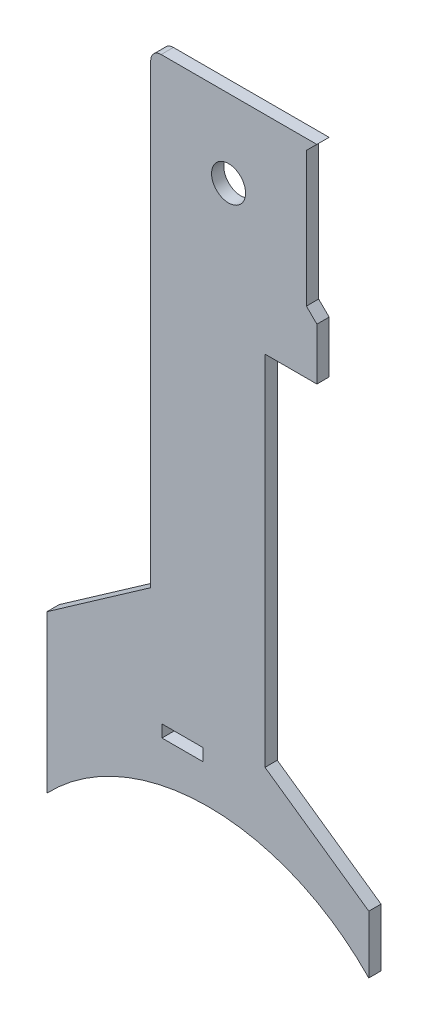
ISO-10303-21;
HEADER;
FILE_DESCRIPTION(('STEP AP214'),'2;1');
FILE_NAME('part.step','',(''),(''),'','','');
FILE_SCHEMA(('AUTOMOTIVE_DESIGN { 1 0 10303 214 1 1 1 1 }'));
ENDSEC;
DATA;
#1=APPLICATION_CONTEXT('core data for automotive mechanical design processes');
#2=APPLICATION_PROTOCOL_DEFINITION('international standard','automotive_design',2000,#1);
#3=PRODUCT_CONTEXT('',#1,'mechanical');
#4=PRODUCT('Part','Part','',(#3));
#5=PRODUCT_RELATED_PRODUCT_CATEGORY('part','',(#4));
#6=PRODUCT_DEFINITION_FORMATION('','',#4);
#7=PRODUCT_DEFINITION_CONTEXT('part definition',#1,'design');
#8=PRODUCT_DEFINITION('design','',#6,#7);
#9=PRODUCT_DEFINITION_SHAPE('','',#8);
#10=(LENGTH_UNIT() NAMED_UNIT(*) SI_UNIT(.MILLI.,.METRE.));
#11=(NAMED_UNIT(*) PLANE_ANGLE_UNIT() SI_UNIT($,.RADIAN.));
#12=(NAMED_UNIT(*) SI_UNIT($,.STERADIAN.) SOLID_ANGLE_UNIT());
#13=UNCERTAINTY_MEASURE_WITH_UNIT(LENGTH_MEASURE(1.E-05),#10,'distance_accuracy_value','');
#14=(GEOMETRIC_REPRESENTATION_CONTEXT(3) GLOBAL_UNCERTAINTY_ASSIGNED_CONTEXT((#13)) GLOBAL_UNIT_ASSIGNED_CONTEXT((#10,
#11,#12)) REPRESENTATION_CONTEXT('',''));
#15=CARTESIAN_POINT('',(0.,0.,0.));
#16=DIRECTION('',(0.,0.,1.));
#17=DIRECTION('',(1.,0.,0.));
#18=AXIS2_PLACEMENT_3D('',#15,#16,#17);
#19=CARTESIAN_POINT('',(-19.2503342679384,34.29,3.));
#20=DIRECTION('',(1.,0.,0.));
#21=DIRECTION('',(0.,0.,-1.));
#22=AXIS2_PLACEMENT_3D('',#19,#20,#21);
#23=PLANE('',#22);
#24=DIRECTION('',(0.,-1.,0.));
#25=VECTOR('',#24,1.);
#26=CARTESIAN_POINT('',(-19.2503342679384,34.29,0.));
#27=LINE('',#26,#25);
#28=CARTESIAN_POINT('',(-19.2503342679384,34.29,0.));
#29=VERTEX_POINT('',#28);
#30=CARTESIAN_POINT('',(-19.2503342679384,1.27,0.));
#31=VERTEX_POINT('',#30);
#32=EDGE_CURVE('E199',#29,#31,#27,.T.);
#33=ORIENTED_EDGE('',*,*,#32,.F.);
#34=DIRECTION('',(0.,0.,-1.));
#35=VECTOR('',#34,1.);
#36=CARTESIAN_POINT('',(-19.2503342679384,34.29,3.));
#37=LINE('',#36,#35);
#38=CARTESIAN_POINT('',(-19.2503342679384,34.29,3.));
#39=VERTEX_POINT('',#38);
#40=EDGE_CURVE('E11',#39,#29,#37,.T.);
#41=ORIENTED_EDGE('',*,*,#40,.F.);
#42=DIRECTION('',(0.,-1.,0.));
#43=VECTOR('',#42,1.);
#44=CARTESIAN_POINT('',(-19.2503342679384,34.29,3.));
#45=LINE('',#44,#43);
#46=CARTESIAN_POINT('',(-19.2503342679384,1.27,3.));
#47=VERTEX_POINT('',#46);
#48=EDGE_CURVE('E202',#39,#47,#45,.T.);
#49=ORIENTED_EDGE('',*,*,#48,.T.);
#50=DIRECTION('',(0.,0.,-1.));
#51=VECTOR('',#50,1.);
#52=CARTESIAN_POINT('',(-19.2503342679384,1.27,3.));
#53=LINE('',#52,#51);
#54=EDGE_CURVE('E37',#47,#31,#53,.T.);
#55=ORIENTED_EDGE('',*,*,#54,.T.);
#56=EDGE_LOOP('',(#33,#41,#49,#55));
#57=FACE_BOUND('',#56,.T.);
#58=ADVANCED_FACE('F34',(#57),#23,.T.);
#59=CARTESIAN_POINT('',(-16.6878,36.83,3.));
#60=DIRECTION('',(0.703977127997857,-0.710222643440695,0.));
#61=DIRECTION('',(0.710222643440695,0.703977127997857,0.));
#62=AXIS2_PLACEMENT_3D('',#59,#60,#61);
#63=PLANE('',#62);
#64=DIRECTION('',(-0.710222643440696,-0.703977127997857,0.));
#65=VECTOR('',#64,1.);
#66=CARTESIAN_POINT('',(-16.6878,36.83,0.));
#67=LINE('',#66,#65);
#68=CARTESIAN_POINT('',(-16.6878,36.83,0.));
#69=VERTEX_POINT('',#68);
#70=EDGE_CURVE('E206',#69,#29,#67,.T.);
#71=ORIENTED_EDGE('',*,*,#70,.F.);
#72=DIRECTION('',(0.,0.,-1.));
#73=VECTOR('',#72,1.);
#74=CARTESIAN_POINT('',(-16.6878,36.83,3.));
#75=LINE('',#74,#73);
#76=CARTESIAN_POINT('',(-16.6878,36.83,3.));
#77=VERTEX_POINT('',#76);
#78=EDGE_CURVE('E42',#77,#69,#75,.T.);
#79=ORIENTED_EDGE('',*,*,#78,.F.);
#80=DIRECTION('',(-0.710222643440696,-0.703977127997857,0.));
#81=VECTOR('',#80,1.);
#82=CARTESIAN_POINT('',(-16.6878,36.83,3.));
#83=LINE('',#82,#81);
#84=EDGE_CURVE('E236',#77,#39,#83,.T.);
#85=ORIENTED_EDGE('',*,*,#84,.T.);
#86=ORIENTED_EDGE('',*,*,#40,.T.);
#87=EDGE_LOOP('',(#71,#79,#85,#86));
#88=FACE_BOUND('',#87,.T.);
#89=ADVANCED_FACE('F313',(#88),#63,.T.);
#90=CARTESIAN_POINT('',(-16.6878,36.83,3.));
#91=DIRECTION('',(0.,-1.,0.));
#92=DIRECTION('',(0.,0.,-1.));
#93=AXIS2_PLACEMENT_3D('',#90,#91,#92);
#94=PLANE('',#93);
#95=DIRECTION('',(-1.,0.,0.));
#96=VECTOR('',#95,1.);
#97=CARTESIAN_POINT('',(-16.6878,36.83,0.));
#98=LINE('',#97,#96);
#99=CARTESIAN_POINT('',(-54.8103342679384,36.83,0.));
#100=VERTEX_POINT('',#99);
#101=EDGE_CURVE('E269',#69,#100,#98,.T.);
#102=ORIENTED_EDGE('',*,*,#101,.T.);
#103=DIRECTION('',(0.,0.,-1.));
#104=VECTOR('',#103,1.);
#105=CARTESIAN_POINT('',(-54.8103342679384,36.83,3.));
#106=LINE('',#105,#104);
#107=CARTESIAN_POINT('',(-54.8103342679384,36.83,3.));
#108=VERTEX_POINT('',#107);
#109=EDGE_CURVE('E274',#108,#100,#106,.T.);
#110=ORIENTED_EDGE('',*,*,#109,.F.);
#111=DIRECTION('',(-1.,0.,0.));
#112=VECTOR('',#111,1.);
#113=CARTESIAN_POINT('',(-16.6878,36.83,3.));
#114=LINE('',#113,#112);
#115=EDGE_CURVE('E234',#77,#108,#114,.T.);
#116=ORIENTED_EDGE('',*,*,#115,.F.);
#117=ORIENTED_EDGE('',*,*,#78,.T.);
#118=EDGE_LOOP('',(#102,#110,#116,#117));
#119=FACE_BOUND('',#118,.T.);
#120=ADVANCED_FACE('F363',(#119),#94,.F.);
#121=CARTESIAN_POINT('',(-54.8103342679384,34.29,3.));
#122=DIRECTION('',(0.,0.,-1.));
#123=DIRECTION('',(-1.,0.,0.));
#124=AXIS2_PLACEMENT_3D('',#121,#122,#123);
#125=CYLINDRICAL_SURFACE('',#124,2.53999999999999);
#126=CARTESIAN_POINT('',(-54.8103342679384,34.29,0.));
#127=DIRECTION('',(0.,0.,1.));
#128=DIRECTION('',(1.,0.,0.));
#129=AXIS2_PLACEMENT_3D('',#126,#127,#128);
#130=CIRCLE('',#129,2.53999999999999);
#131=CARTESIAN_POINT('',(-57.3503342679384,34.29,0.));
#132=VERTEX_POINT('',#131);
#133=EDGE_CURVE('E267',#100,#132,#130,.T.);
#134=ORIENTED_EDGE('',*,*,#133,.T.);
#135=DIRECTION('',(0.,0.,-1.));
#136=VECTOR('',#135,1.);
#137=CARTESIAN_POINT('',(-57.3503342679384,34.29,3.));
#138=LINE('',#137,#136);
#139=CARTESIAN_POINT('',(-57.3503342679384,34.29,3.));
#140=VERTEX_POINT('',#139);
#141=EDGE_CURVE('E277',#140,#132,#138,.T.);
#142=ORIENTED_EDGE('',*,*,#141,.F.);
#143=CARTESIAN_POINT('',(-54.8103342679384,34.29,3.));
#144=DIRECTION('',(0.,0.,1.));
#145=DIRECTION('',(1.,0.,0.));
#146=AXIS2_PLACEMENT_3D('',#143,#144,#145);
#147=CIRCLE('',#146,2.53999999999999);
#148=EDGE_CURVE('E232',#108,#140,#147,.T.);
#149=ORIENTED_EDGE('',*,*,#148,.F.);
#150=ORIENTED_EDGE('',*,*,#109,.T.);
#151=EDGE_LOOP('',(#134,#142,#149,#150));
#152=FACE_BOUND('',#151,.T.);
#153=ADVANCED_FACE('F359',(#152),#125,.T.);
#154=CARTESIAN_POINT('',(-57.3503342679384,34.29,3.));
#155=DIRECTION('',(1.,0.,0.));
#156=DIRECTION('',(0.,1.,0.));
#157=AXIS2_PLACEMENT_3D('',#154,#155,#156);
#158=PLANE('',#157);
#159=DIRECTION('',(0.,-1.,0.));
#160=VECTOR('',#159,1.);
#161=CARTESIAN_POINT('',(-57.3503342679384,34.29,0.));
#162=LINE('',#161,#160);
#163=CARTESIAN_POINT('',(-57.3503342679384,-77.47,0.));
#164=VERTEX_POINT('',#163);
#165=EDGE_CURVE('E265',#132,#164,#162,.T.);
#166=ORIENTED_EDGE('',*,*,#165,.T.);
#167=DIRECTION('',(0.,0.,-1.));
#168=VECTOR('',#167,1.);
#169=CARTESIAN_POINT('',(-57.3503342679384,-77.47,3.));
#170=LINE('',#169,#168);
#171=CARTESIAN_POINT('',(-57.3503342679384,-77.47,3.));
#172=VERTEX_POINT('',#171);
#173=EDGE_CURVE('E280',#172,#164,#170,.T.);
#174=ORIENTED_EDGE('',*,*,#173,.F.);
#175=DIRECTION('',(0.,-1.,0.));
#176=VECTOR('',#175,1.);
#177=CARTESIAN_POINT('',(-57.3503342679384,34.29,3.));
#178=LINE('',#177,#176);
#179=EDGE_CURVE('E230',#140,#172,#178,.T.);
#180=ORIENTED_EDGE('',*,*,#179,.F.);
#181=ORIENTED_EDGE('',*,*,#141,.T.);
#182=EDGE_LOOP('',(#166,#174,#180,#181));
#183=FACE_BOUND('',#182,.T.);
#184=ADVANCED_FACE('F356',(#183),#158,.F.);
#185=CARTESIAN_POINT('',(-57.3503342679384,-77.47,3.));
#186=DIRECTION('',(0.573462344363328,-0.819231920519041,0.));
#187=DIRECTION('',(0.819231920519041,0.573462344363328,0.));
#188=AXIS2_PLACEMENT_3D('',#185,#186,#187);
#189=PLANE('',#188);
#190=DIRECTION('',(-0.819231920519041,-0.573462344363328,0.));
#191=VECTOR('',#190,1.);
#192=CARTESIAN_POINT('',(-57.3503342679384,-77.47,0.));
#193=LINE('',#192,#191);
#194=CARTESIAN_POINT('',(-82.7503342679384,-95.25,0.));
#195=VERTEX_POINT('',#194);
#196=EDGE_CURVE('E263',#164,#195,#193,.T.);
#197=ORIENTED_EDGE('',*,*,#196,.T.);
#198=DIRECTION('',(0.,0.,-1.));
#199=VECTOR('',#198,1.);
#200=CARTESIAN_POINT('',(-82.7503342679384,-95.25,3.));
#201=LINE('',#200,#199);
#202=CARTESIAN_POINT('',(-82.7503342679384,-95.25,3.));
#203=VERTEX_POINT('',#202);
#204=EDGE_CURVE('E283',#203,#195,#201,.T.);
#205=ORIENTED_EDGE('',*,*,#204,.F.);
#206=DIRECTION('',(-0.819231920519041,-0.573462344363328,0.));
#207=VECTOR('',#206,1.);
#208=CARTESIAN_POINT('',(-57.3503342679384,-77.47,3.));
#209=LINE('',#208,#207);
#210=EDGE_CURVE('E228',#172,#203,#209,.T.);
#211=ORIENTED_EDGE('',*,*,#210,.F.);
#212=ORIENTED_EDGE('',*,*,#173,.T.);
#213=EDGE_LOOP('',(#197,#205,#211,#212));
#214=FACE_BOUND('',#213,.T.);
#215=ADVANCED_FACE('F352',(#214),#189,.F.);
#216=CARTESIAN_POINT('',(-82.7503342679384,-95.25,3.));
#217=DIRECTION('',(1.,0.,0.));
#218=DIRECTION('',(0.,0.,-1.));
#219=AXIS2_PLACEMENT_3D('',#216,#217,#218);
#220=PLANE('',#219);
#221=DIRECTION('',(0.,-1.,0.));
#222=VECTOR('',#221,1.);
#223=CARTESIAN_POINT('',(-82.7503342679384,-95.25,0.));
#224=LINE('',#223,#222);
#225=CARTESIAN_POINT('',(-82.7503342679384,-133.721119177128,0.));
#226=VERTEX_POINT('',#225);
#227=EDGE_CURVE('E260',#195,#226,#224,.T.);
#228=ORIENTED_EDGE('',*,*,#227,.T.);
#229=DIRECTION('',(0.,0.,-1.));
#230=VECTOR('',#229,1.);
#231=CARTESIAN_POINT('',(-82.7503342679384,-133.721119177128,3.));
#232=LINE('',#231,#230);
#233=CARTESIAN_POINT('',(-82.7503342679384,-133.721119177128,3.));
#234=VERTEX_POINT('',#233);
#235=EDGE_CURVE('E286',#234,#226,#232,.T.);
#236=ORIENTED_EDGE('',*,*,#235,.F.);
#237=DIRECTION('',(0.,-1.,0.));
#238=VECTOR('',#237,1.);
#239=CARTESIAN_POINT('',(-82.7503342679384,-95.25,3.));
#240=LINE('',#239,#238);
#241=EDGE_CURVE('E226',#203,#234,#240,.T.);
#242=ORIENTED_EDGE('',*,*,#241,.F.);
#243=ORIENTED_EDGE('',*,*,#204,.T.);
#244=EDGE_LOOP('',(#228,#236,#242,#243));
#245=FACE_BOUND('',#244,.T.);
#246=ADVANCED_FACE('F347',(#245),#220,.F.);
#247=CARTESIAN_POINT('',(-43.2689,-171.45,3.));
#248=DIRECTION('',(0.,0.,-1.));
#249=DIRECTION('',(-1.,0.,0.));
#250=AXIS2_PLACEMENT_3D('',#247,#248,#249);
#251=CYLINDRICAL_SURFACE('',#250,54.61);
#252=CARTESIAN_POINT('',(-43.2689,-171.45,0.));
#253=DIRECTION('',(0.,0.,1.));
#254=DIRECTION('',(1.,0.,0.));
#255=AXIS2_PLACEMENT_3D('',#252,#253,#254);
#256=CIRCLE('',#255,54.61);
#257=CARTESIAN_POINT('',(-3.98018344756646,-133.520475198567,0.));
#258=VERTEX_POINT('',#257);
#259=EDGE_CURVE('E257',#258,#226,#256,.T.);
#260=ORIENTED_EDGE('',*,*,#259,.F.);
#261=DIRECTION('',(0.,0.,-1.));
#262=VECTOR('',#261,1.);
#263=CARTESIAN_POINT('',(-3.98018344756646,-133.520475198567,3.));
#264=LINE('',#263,#262);
#265=CARTESIAN_POINT('',(-3.98018344756646,-133.520475198567,3.));
#266=VERTEX_POINT('',#265);
#267=EDGE_CURVE('E288',#266,#258,#264,.T.);
#268=ORIENTED_EDGE('',*,*,#267,.F.);
#269=CARTESIAN_POINT('',(-43.2689,-171.45,3.));
#270=DIRECTION('',(0.,0.,1.));
#271=DIRECTION('',(1.,0.,0.));
#272=AXIS2_PLACEMENT_3D('',#269,#270,#271);
#273=CIRCLE('',#272,54.61);
#274=EDGE_CURVE('E223',#266,#234,#273,.T.);
#275=ORIENTED_EDGE('',*,*,#274,.T.);
#276=ORIENTED_EDGE('',*,*,#235,.T.);
#277=EDGE_LOOP('',(#260,#268,#275,#276));
#278=FACE_BOUND('',#277,.T.);
#279=ADVANCED_FACE('F341',(#278),#251,.F.);
#280=CARTESIAN_POINT('',(-3.98018344756646,-119.349325812136,3.));
#281=DIRECTION('',(1.,0.,0.));
#282=DIRECTION('',(0.,0.,-1.));
#283=AXIS2_PLACEMENT_3D('',#280,#281,#282);
#284=PLANE('',#283);
#285=DIRECTION('',(0.,-1.,0.));
#286=VECTOR('',#285,1.);
#287=CARTESIAN_POINT('',(-3.98018344756646,-119.349325812136,0.));
#288=LINE('',#287,#286);
#289=CARTESIAN_POINT('',(-3.98018344756646,-119.349325812136,0.));
#290=VERTEX_POINT('',#289);
#291=EDGE_CURVE('E254',#290,#258,#288,.T.);
#292=ORIENTED_EDGE('',*,*,#291,.F.);
#293=DIRECTION('',(0.,0.,-1.));
#294=VECTOR('',#293,1.);
#295=CARTESIAN_POINT('',(-3.98018344756646,-119.349325812136,3.));
#296=LINE('',#295,#294);
#297=CARTESIAN_POINT('',(-3.98018344756646,-119.349325812136,3.));
#298=VERTEX_POINT('',#297);
#299=EDGE_CURVE('E290',#298,#290,#296,.T.);
#300=ORIENTED_EDGE('',*,*,#299,.F.);
#301=DIRECTION('',(0.,-1.,0.));
#302=VECTOR('',#301,1.);
#303=CARTESIAN_POINT('',(-3.98018344756646,-119.349325812136,3.));
#304=LINE('',#303,#302);
#305=EDGE_CURVE('E220',#298,#266,#304,.T.);
#306=ORIENTED_EDGE('',*,*,#305,.T.);
#307=ORIENTED_EDGE('',*,*,#267,.T.);
#308=EDGE_LOOP('',(#292,#300,#306,#307));
#309=FACE_BOUND('',#308,.T.);
#310=ADVANCED_FACE('F338',(#309),#284,.T.);
#311=CARTESIAN_POINT('',(-3.98018344756646,-119.349325812136,3.));
#312=DIRECTION('',(-0.57357643635105,-0.819152044288989,0.));
#313=DIRECTION('',(0.819152044288989,-0.57357643635105,0.));
#314=AXIS2_PLACEMENT_3D('',#311,#312,#313);
#315=PLANE('',#314);
#316=DIRECTION('',(-0.819152044288989,0.57357643635105,0.));
#317=VECTOR('',#316,1.);
#318=CARTESIAN_POINT('',(-3.98018344756646,-119.349325812136,0.));
#319=LINE('',#318,#317);
#320=CARTESIAN_POINT('',(-29.3801834475665,-101.564054341609,0.));
#321=VERTEX_POINT('',#320);
#322=EDGE_CURVE('E252',#290,#321,#319,.T.);
#323=ORIENTED_EDGE('',*,*,#322,.T.);
#324=DIRECTION('',(0.,0.,-1.));
#325=VECTOR('',#324,1.);
#326=CARTESIAN_POINT('',(-29.3801834475665,-101.564054341609,3.));
#327=LINE('',#326,#325);
#328=CARTESIAN_POINT('',(-29.3801834475665,-101.564054341609,3.));
#329=VERTEX_POINT('',#328);
#330=EDGE_CURVE('E292',#329,#321,#327,.T.);
#331=ORIENTED_EDGE('',*,*,#330,.F.);
#332=DIRECTION('',(-0.819152044288989,0.57357643635105,0.));
#333=VECTOR('',#332,1.);
#334=CARTESIAN_POINT('',(-3.98018344756646,-119.349325812136,3.));
#335=LINE('',#334,#333);
#336=EDGE_CURVE('E217',#298,#329,#335,.T.);
#337=ORIENTED_EDGE('',*,*,#336,.F.);
#338=ORIENTED_EDGE('',*,*,#299,.T.);
#339=EDGE_LOOP('',(#323,#331,#337,#338));
#340=FACE_BOUND('',#339,.T.);
#341=ADVANCED_FACE('F335',(#340),#315,.F.);
#342=CARTESIAN_POINT('',(-29.3801834475665,-101.564054341609,3.));
#343=DIRECTION('',(-1.,0.,0.));
#344=DIRECTION('',(0.,-1.,0.));
#345=AXIS2_PLACEMENT_3D('',#342,#343,#344);
#346=PLANE('',#345);
#347=DIRECTION('',(0.,1.,0.));
#348=VECTOR('',#347,1.);
#349=CARTESIAN_POINT('',(-29.3801834475665,-101.564054341609,0.));
#350=LINE('',#349,#348);
#351=CARTESIAN_POINT('',(-29.3801834475665,-13.97,0.));
#352=VERTEX_POINT('',#351);
#353=EDGE_CURVE('E250',#321,#352,#350,.T.);
#354=ORIENTED_EDGE('',*,*,#353,.T.);
#355=DIRECTION('',(0.,0.,-1.));
#356=VECTOR('',#355,1.);
#357=CARTESIAN_POINT('',(-29.3801834475665,-13.97,3.));
#358=LINE('',#357,#356);
#359=CARTESIAN_POINT('',(-29.3801834475665,-13.97,3.));
#360=VERTEX_POINT('',#359);
#361=EDGE_CURVE('E295',#360,#352,#358,.T.);
#362=ORIENTED_EDGE('',*,*,#361,.F.);
#363=DIRECTION('',(0.,-1.,0.));
#364=VECTOR('',#363,1.);
#365=CARTESIAN_POINT('',(-29.3801834475665,-13.97,3.));
#366=LINE('',#365,#364);
#367=EDGE_CURVE('E215',#360,#329,#366,.T.);
#368=ORIENTED_EDGE('',*,*,#367,.T.);
#369=ORIENTED_EDGE('',*,*,#330,.T.);
#370=EDGE_LOOP('',(#354,#362,#368,#369));
#371=FACE_BOUND('',#370,.T.);
#372=ADVANCED_FACE('F329',(#371),#346,.F.);
#373=CARTESIAN_POINT('',(-16.6801834475665,-13.97,3.));
#374=DIRECTION('',(0.,-1.,0.));
#375=DIRECTION('',(0.,0.,-1.));
#376=AXIS2_PLACEMENT_3D('',#373,#374,#375);
#377=PLANE('',#376);
#378=DIRECTION('',(-1.,0.,0.));
#379=VECTOR('',#378,1.);
#380=CARTESIAN_POINT('',(-16.6801834475665,-13.97,0.));
#381=LINE('',#380,#379);
#382=CARTESIAN_POINT('',(-16.6801834475665,-13.97,0.));
#383=VERTEX_POINT('',#382);
#384=EDGE_CURVE('E247',#383,#352,#381,.T.);
#385=ORIENTED_EDGE('',*,*,#384,.F.);
#386=DIRECTION('',(0.,0.,-1.));
#387=VECTOR('',#386,1.);
#388=CARTESIAN_POINT('',(-16.6801834475665,-13.97,3.));
#389=LINE('',#388,#387);
#390=CARTESIAN_POINT('',(-16.6801834475665,-13.97,3.));
#391=VERTEX_POINT('',#390);
#392=EDGE_CURVE('E298',#391,#383,#389,.T.);
#393=ORIENTED_EDGE('',*,*,#392,.F.);
#394=DIRECTION('',(-1.,0.,0.));
#395=VECTOR('',#394,1.);
#396=CARTESIAN_POINT('',(-16.6801834475665,-13.97,3.));
#397=LINE('',#396,#395);
#398=EDGE_CURVE('E212',#391,#360,#397,.T.);
#399=ORIENTED_EDGE('',*,*,#398,.T.);
#400=ORIENTED_EDGE('',*,*,#361,.T.);
#401=EDGE_LOOP('',(#385,#393,#399,#400));
#402=FACE_BOUND('',#401,.T.);
#403=ADVANCED_FACE('F327',(#402),#377,.T.);
#404=CARTESIAN_POINT('',(-16.6801834475665,-1.27000000000001,3.));
#405=DIRECTION('',(1.,0.,0.));
#406=DIRECTION('',(0.,0.,-1.));
#407=AXIS2_PLACEMENT_3D('',#404,#405,#406);
#408=PLANE('',#407);
#409=DIRECTION('',(0.,-1.,0.));
#410=VECTOR('',#409,1.);
#411=CARTESIAN_POINT('',(-16.6801834475665,-1.27000000000001,0.));
#412=LINE('',#411,#410);
#413=CARTESIAN_POINT('',(-16.6801834475665,-1.27000000000001,0.));
#414=VERTEX_POINT('',#413);
#415=EDGE_CURVE('E244',#414,#383,#412,.T.);
#416=ORIENTED_EDGE('',*,*,#415,.F.);
#417=DIRECTION('',(0.,0.,-1.));
#418=VECTOR('',#417,1.);
#419=CARTESIAN_POINT('',(-16.6801834475665,-1.27000000000001,3.));
#420=LINE('',#419,#418);
#421=CARTESIAN_POINT('',(-16.6801834475665,-1.27000000000001,3.));
#422=VERTEX_POINT('',#421);
#423=EDGE_CURVE('E299',#422,#414,#420,.T.);
#424=ORIENTED_EDGE('',*,*,#423,.F.);
#425=DIRECTION('',(0.,-1.,0.));
#426=VECTOR('',#425,1.);
#427=CARTESIAN_POINT('',(-16.6801834475665,-1.27000000000001,3.));
#428=LINE('',#427,#426);
#429=EDGE_CURVE('E209',#422,#391,#428,.T.);
#430=ORIENTED_EDGE('',*,*,#429,.T.);
#431=ORIENTED_EDGE('',*,*,#392,.T.);
#432=EDGE_LOOP('',(#416,#424,#430,#431));
#433=FACE_BOUND('',#432,.T.);
#434=ADVANCED_FACE('F322',(#433),#408,.T.);
#435=CARTESIAN_POINT('',(-19.2503342679384,1.27,3.));
#436=DIRECTION('',(0.702922487402486,0.71126645970684,0.));
#437=DIRECTION('',(-0.71126645970684,0.702922487402486,0.));
#438=AXIS2_PLACEMENT_3D('',#435,#436,#437);
#439=PLANE('',#438);
#440=DIRECTION('',(0.71126645970684,-0.702922487402486,0.));
#441=VECTOR('',#440,1.);
#442=CARTESIAN_POINT('',(-19.2503342679384,1.27,0.));
#443=LINE('',#442,#441);
#444=EDGE_CURVE('E241',#31,#414,#443,.T.);
#445=ORIENTED_EDGE('',*,*,#444,.F.);
#446=ORIENTED_EDGE('',*,*,#54,.F.);
#447=DIRECTION('',(0.71126645970684,-0.702922487402486,0.));
#448=VECTOR('',#447,1.);
#449=CARTESIAN_POINT('',(-19.2503342679384,1.27,3.));
#450=LINE('',#449,#448);
#451=EDGE_CURVE('E205',#47,#422,#450,.T.);
#452=ORIENTED_EDGE('',*,*,#451,.T.);
#453=ORIENTED_EDGE('',*,*,#423,.T.);
#454=EDGE_LOOP('',(#445,#446,#452,#453));
#455=FACE_BOUND('',#454,.T.);
#456=ADVANCED_FACE('F307',(#455),#439,.T.);
#457=CARTESIAN_POINT('',(-43.2689,-171.45,3.));
#458=DIRECTION('',(0.,0.,1.));
#459=DIRECTION('',(1.,0.,0.));
#460=AXIS2_PLACEMENT_3D('',#457,#458,#459);
#461=PLANE('',#460);
#462=DIRECTION('',(0.,-1.,0.));
#463=VECTOR('',#462,1.);
#464=CARTESIAN_POINT('',(-54.6021371697594,-107.961390659032,3.));
#465=LINE('',#464,#463);
#466=CARTESIAN_POINT('',(-54.6021371697594,-104.961390659032,3.));
#467=VERTEX_POINT('',#466);
#468=CARTESIAN_POINT('',(-54.6021371697594,-107.961390659032,3.));
#469=VERTEX_POINT('',#468);
#470=EDGE_CURVE('E50',#467,#469,#465,.T.);
#471=ORIENTED_EDGE('',*,*,#470,.F.);
#472=DIRECTION('',(-1.,0.,0.));
#473=VECTOR('',#472,1.);
#474=CARTESIAN_POINT('',(-44.6021371037594,-104.961390659032,3.));
#475=LINE('',#474,#473);
#476=CARTESIAN_POINT('',(-44.6021371037594,-104.961390659032,3.));
#477=VERTEX_POINT('',#476);
#478=EDGE_CURVE('E177',#477,#467,#475,.T.);
#479=ORIENTED_EDGE('',*,*,#478,.F.);
#480=DIRECTION('',(0.,1.,0.));
#481=VECTOR('',#480,1.);
#482=CARTESIAN_POINT('',(-44.6021371037594,-107.961390659032,3.));
#483=LINE('',#482,#481);
#484=CARTESIAN_POINT('',(-44.6021371037594,-107.961390659032,3.));
#485=VERTEX_POINT('',#484);
#486=EDGE_CURVE('E180',#485,#477,#483,.T.);
#487=ORIENTED_EDGE('',*,*,#486,.F.);
#488=DIRECTION('',(1.,0.,0.));
#489=VECTOR('',#488,1.);
#490=CARTESIAN_POINT('',(-44.6021371037594,-107.961390659032,3.));
#491=LINE('',#490,#489);
#492=EDGE_CURVE('E186',#469,#485,#491,.T.);
#493=ORIENTED_EDGE('',*,*,#492,.F.);
#494=EDGE_LOOP('',(#471,#479,#487,#493));
#495=FACE_BOUND('',#494,.T.);
#496=CARTESIAN_POINT('',(-38.3003342679384,17.78,3.));
#497=DIRECTION('',(0.,0.,1.));
#498=DIRECTION('',(1.,0.,0.));
#499=AXIS2_PLACEMENT_3D('',#496,#497,#498);
#500=CIRCLE('',#499,4.1656);
#501=CARTESIAN_POINT('',(-34.1347342679384,17.78,3.));
#502=VERTEX_POINT('',#501);
#503=EDGE_CURVE('E192',#502,#502,#500,.T.);
#504=ORIENTED_EDGE('',*,*,#503,.F.);
#505=EDGE_LOOP('',(#504));
#506=FACE_BOUND('',#505,.T.);
#507=ORIENTED_EDGE('',*,*,#48,.F.);
#508=ORIENTED_EDGE('',*,*,#84,.F.);
#509=ORIENTED_EDGE('',*,*,#115,.T.);
#510=ORIENTED_EDGE('',*,*,#148,.T.);
#511=ORIENTED_EDGE('',*,*,#179,.T.);
#512=ORIENTED_EDGE('',*,*,#210,.T.);
#513=ORIENTED_EDGE('',*,*,#241,.T.);
#514=ORIENTED_EDGE('',*,*,#274,.F.);
#515=ORIENTED_EDGE('',*,*,#305,.F.);
#516=ORIENTED_EDGE('',*,*,#336,.T.);
#517=ORIENTED_EDGE('',*,*,#367,.F.);
#518=ORIENTED_EDGE('',*,*,#398,.F.);
#519=ORIENTED_EDGE('',*,*,#429,.F.);
#520=ORIENTED_EDGE('',*,*,#451,.F.);
#521=EDGE_LOOP('',(#507,#508,#509,#510,#511,#512,#513,#514,#515,#516,#517,#518,#519,#520));
#522=FACE_BOUND('',#521,.T.);
#523=ADVANCED_FACE('F317',(#495,#506,#522),#461,.T.);
#524=CARTESIAN_POINT('',(-43.2689,-171.45,0.));
#525=DIRECTION('',(0.,0.,1.));
#526=DIRECTION('',(1.,0.,0.));
#527=AXIS2_PLACEMENT_3D('',#524,#525,#526);
#528=PLANE('',#527);
#529=DIRECTION('',(-1.,0.,0.));
#530=VECTOR('',#529,1.);
#531=CARTESIAN_POINT('',(-44.6021371037594,-104.961390659032,0.));
#532=LINE('',#531,#530);
#533=CARTESIAN_POINT('',(-44.6021371037594,-104.961390659032,0.));
#534=VERTEX_POINT('',#533);
#535=CARTESIAN_POINT('',(-54.6021371697594,-104.961390659032,0.));
#536=VERTEX_POINT('',#535);
#537=EDGE_CURVE('E167',#534,#536,#532,.T.);
#538=ORIENTED_EDGE('',*,*,#537,.T.);
#539=DIRECTION('',(0.,-1.,0.));
#540=VECTOR('',#539,1.);
#541=CARTESIAN_POINT('',(-54.6021371697594,-107.961390659032,0.));
#542=LINE('',#541,#540);
#543=CARTESIAN_POINT('',(-54.6021371697594,-107.961390659032,0.));
#544=VERTEX_POINT('',#543);
#545=EDGE_CURVE('E161',#536,#544,#542,.T.);
#546=ORIENTED_EDGE('',*,*,#545,.T.);
#547=DIRECTION('',(1.,0.,0.));
#548=VECTOR('',#547,1.);
#549=CARTESIAN_POINT('',(-44.6021371037594,-107.961390659032,0.));
#550=LINE('',#549,#548);
#551=CARTESIAN_POINT('',(-44.6021371037594,-107.961390659032,0.));
#552=VERTEX_POINT('',#551);
#553=EDGE_CURVE('E170',#544,#552,#550,.T.);
#554=ORIENTED_EDGE('',*,*,#553,.T.);
#555=DIRECTION('',(0.,1.,0.));
#556=VECTOR('',#555,1.);
#557=CARTESIAN_POINT('',(-44.6021371037594,-107.961390659032,0.));
#558=LINE('',#557,#556);
#559=EDGE_CURVE('E58',#552,#534,#558,.T.);
#560=ORIENTED_EDGE('',*,*,#559,.T.);
#561=EDGE_LOOP('',(#538,#546,#554,#560));
#562=FACE_BOUND('',#561,.T.);
#563=CARTESIAN_POINT('',(-38.3003342679384,17.78,0.));
#564=DIRECTION('',(0.,0.,1.));
#565=DIRECTION('',(1.,0.,0.));
#566=AXIS2_PLACEMENT_3D('',#563,#564,#565);
#567=CIRCLE('',#566,4.1656);
#568=CARTESIAN_POINT('',(-34.1347342679384,17.78,0.));
#569=VERTEX_POINT('',#568);
#570=EDGE_CURVE('E196',#569,#569,#567,.T.);
#571=ORIENTED_EDGE('',*,*,#570,.T.);
#572=EDGE_LOOP('',(#571));
#573=FACE_BOUND('',#572,.T.);
#574=ORIENTED_EDGE('',*,*,#32,.T.);
#575=ORIENTED_EDGE('',*,*,#444,.T.);
#576=ORIENTED_EDGE('',*,*,#415,.T.);
#577=ORIENTED_EDGE('',*,*,#384,.T.);
#578=ORIENTED_EDGE('',*,*,#353,.F.);
#579=ORIENTED_EDGE('',*,*,#322,.F.);
#580=ORIENTED_EDGE('',*,*,#291,.T.);
#581=ORIENTED_EDGE('',*,*,#259,.T.);
#582=ORIENTED_EDGE('',*,*,#227,.F.);
#583=ORIENTED_EDGE('',*,*,#196,.F.);
#584=ORIENTED_EDGE('',*,*,#165,.F.);
#585=ORIENTED_EDGE('',*,*,#133,.F.);
#586=ORIENTED_EDGE('',*,*,#101,.F.);
#587=ORIENTED_EDGE('',*,*,#70,.T.);
#588=EDGE_LOOP('',(#574,#575,#576,#577,#578,#579,#580,#581,#582,#583,#584,#585,#586,#587));
#589=FACE_BOUND('',#588,.T.);
#590=ADVANCED_FACE('F174',(#562,#573,#589),#528,.F.);
#591=CARTESIAN_POINT('',(-38.3003342679384,17.78,0.));
#592=DIRECTION('',(0.,0.,1.));
#593=DIRECTION('',(1.,0.,0.));
#594=AXIS2_PLACEMENT_3D('',#591,#592,#593);
#595=CYLINDRICAL_SURFACE('',#594,4.1656);
#596=ORIENTED_EDGE('',*,*,#570,.F.);
#597=EDGE_LOOP('',(#596));
#598=FACE_BOUND('',#597,.T.);
#599=ORIENTED_EDGE('',*,*,#503,.T.);
#600=EDGE_LOOP('',(#599));
#601=FACE_BOUND('',#600,.T.);
#602=ADVANCED_FACE('F476',(#598,#601),#595,.F.);
#603=CARTESIAN_POINT('',(-54.6021371697594,-107.961390659032,0.));
#604=DIRECTION('',(-1.,0.,0.));
#605=DIRECTION('',(0.,0.,1.));
#606=AXIS2_PLACEMENT_3D('',#603,#604,#605);
#607=PLANE('',#606);
#608=ORIENTED_EDGE('',*,*,#470,.T.);
#609=DIRECTION('',(0.,0.,1.));
#610=VECTOR('',#609,1.);
#611=CARTESIAN_POINT('',(-54.6021371697594,-107.961390659032,0.));
#612=LINE('',#611,#610);
#613=EDGE_CURVE('E157',#544,#469,#612,.T.);
#614=ORIENTED_EDGE('',*,*,#613,.F.);
#615=ORIENTED_EDGE('',*,*,#545,.F.);
#616=DIRECTION('',(0.,0.,1.));
#617=VECTOR('',#616,1.);
#618=CARTESIAN_POINT('',(-54.6021371697594,-104.961390659032,0.));
#619=LINE('',#618,#617);
#620=EDGE_CURVE('E190',#536,#467,#619,.T.);
#621=ORIENTED_EDGE('',*,*,#620,.T.);
#622=EDGE_LOOP('',(#608,#614,#615,#621));
#623=FACE_BOUND('',#622,.T.);
#624=ADVANCED_FACE('F159',(#623),#607,.F.);
#625=CARTESIAN_POINT('',(-44.6021371037594,-104.961390659032,0.));
#626=DIRECTION('',(0.,1.,0.));
#627=DIRECTION('',(0.,0.,1.));
#628=AXIS2_PLACEMENT_3D('',#625,#626,#627);
#629=PLANE('',#628);
#630=ORIENTED_EDGE('',*,*,#478,.T.);
#631=ORIENTED_EDGE('',*,*,#620,.F.);
#632=ORIENTED_EDGE('',*,*,#537,.F.);
#633=DIRECTION('',(0.,0.,1.));
#634=VECTOR('',#633,1.);
#635=CARTESIAN_POINT('',(-44.6021371037594,-104.961390659032,0.));
#636=LINE('',#635,#634);
#637=EDGE_CURVE('E193',#534,#477,#636,.T.);
#638=ORIENTED_EDGE('',*,*,#637,.T.);
#639=EDGE_LOOP('',(#630,#631,#632,#638));
#640=FACE_BOUND('',#639,.T.);
#641=ADVANCED_FACE('F505',(#640),#629,.F.);
#642=CARTESIAN_POINT('',(-44.6021371037594,-107.961390659032,0.));
#643=DIRECTION('',(1.,0.,0.));
#644=DIRECTION('',(0.,0.,-1.));
#645=AXIS2_PLACEMENT_3D('',#642,#643,#644);
#646=PLANE('',#645);
#647=ORIENTED_EDGE('',*,*,#486,.T.);
#648=ORIENTED_EDGE('',*,*,#637,.F.);
#649=ORIENTED_EDGE('',*,*,#559,.F.);
#650=DIRECTION('',(0.,0.,1.));
#651=VECTOR('',#650,1.);
#652=CARTESIAN_POINT('',(-44.6021371037594,-107.961390659032,0.));
#653=LINE('',#652,#651);
#654=EDGE_CURVE('E166',#552,#485,#653,.T.);
#655=ORIENTED_EDGE('',*,*,#654,.T.);
#656=EDGE_LOOP('',(#647,#648,#649,#655));
#657=FACE_BOUND('',#656,.T.);
#658=ADVANCED_FACE('F514',(#657),#646,.F.);
#659=CARTESIAN_POINT('',(-44.6021371037594,-107.961390659032,0.));
#660=DIRECTION('',(0.,-1.,0.));
#661=DIRECTION('',(0.,0.,-1.));
#662=AXIS2_PLACEMENT_3D('',#659,#660,#661);
#663=PLANE('',#662);
#664=ORIENTED_EDGE('',*,*,#492,.T.);
#665=ORIENTED_EDGE('',*,*,#654,.F.);
#666=ORIENTED_EDGE('',*,*,#553,.F.);
#667=ORIENTED_EDGE('',*,*,#613,.T.);
#668=EDGE_LOOP('',(#664,#665,#666,#667));
#669=FACE_BOUND('',#668,.T.);
#670=ADVANCED_FACE('F171',(#669),#663,.F.);
#671=CLOSED_SHELL('',(#58,#89,#120,#153,#184,#215,#246,#279,#310,#341,#372,#403,#434,#456,#523,
#590,#602,#624,#641,#658,#670));
#672=MANIFOLD_SOLID_BREP('B2',#671);
#673=ADVANCED_BREP_SHAPE_REPRESENTATION('',(#18,#672),#14);
#674=SHAPE_DEFINITION_REPRESENTATION(#9,#673);
ENDSEC;
END-ISO-10303-21;
